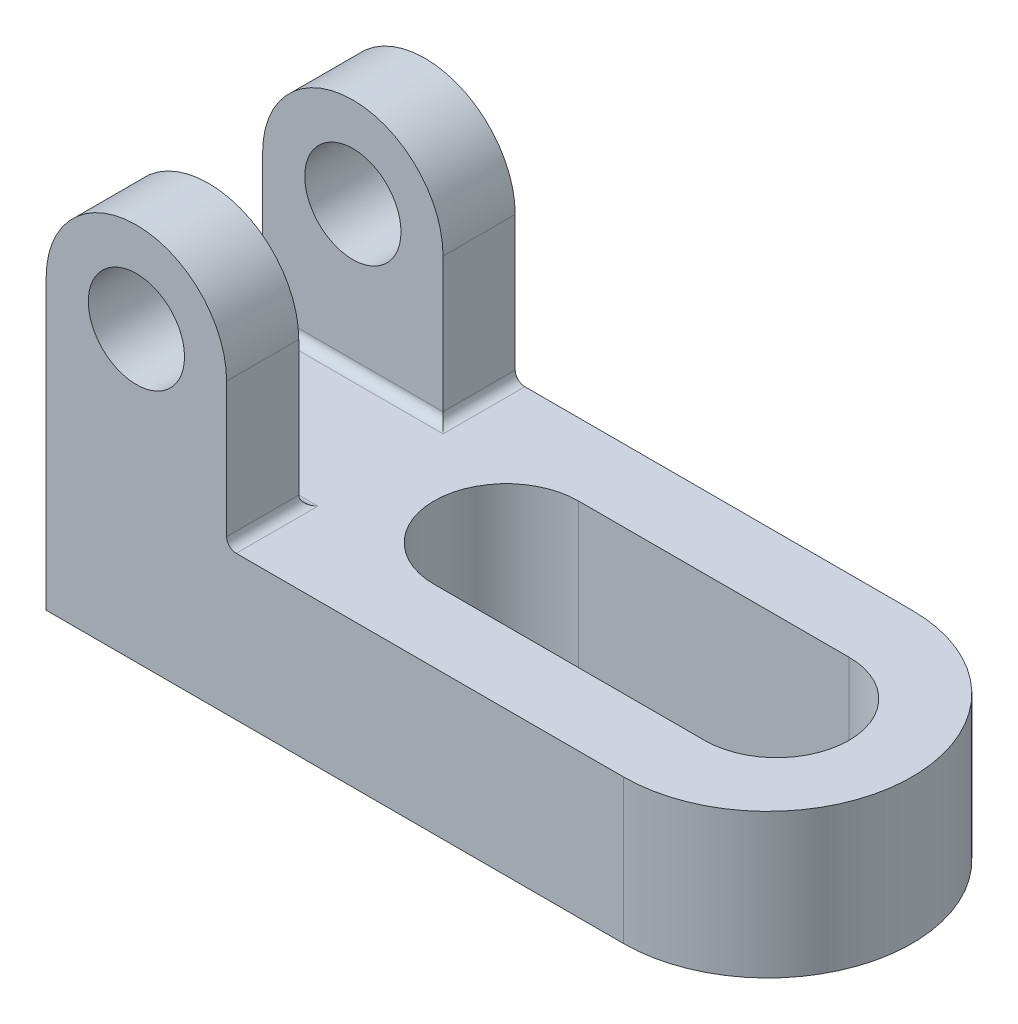
ISO-10303-21;
HEADER;
FILE_DESCRIPTION(('STEP AP214'),'2;1');
FILE_NAME('part.step','',(''),(''),'','','');
FILE_SCHEMA(('AUTOMOTIVE_DESIGN { 1 0 10303 214 1 1 1 1 }'));
ENDSEC;
DATA;
#1=APPLICATION_CONTEXT('core data for automotive mechanical design processes');
#2=APPLICATION_PROTOCOL_DEFINITION('international standard','automotive_design',2000,#1);
#3=PRODUCT_CONTEXT('',#1,'mechanical');
#4=PRODUCT('Part','Part','',(#3));
#5=PRODUCT_RELATED_PRODUCT_CATEGORY('part','',(#4));
#6=PRODUCT_DEFINITION_FORMATION('','',#4);
#7=PRODUCT_DEFINITION_CONTEXT('part definition',#1,'design');
#8=PRODUCT_DEFINITION('design','',#6,#7);
#9=PRODUCT_DEFINITION_SHAPE('','',#8);
#10=(LENGTH_UNIT() NAMED_UNIT(*) SI_UNIT(.MILLI.,.METRE.));
#11=(NAMED_UNIT(*) PLANE_ANGLE_UNIT() SI_UNIT($,.RADIAN.));
#12=(NAMED_UNIT(*) SI_UNIT($,.STERADIAN.) SOLID_ANGLE_UNIT());
#13=UNCERTAINTY_MEASURE_WITH_UNIT(LENGTH_MEASURE(1.E-05),#10,'distance_accuracy_value','');
#14=(GEOMETRIC_REPRESENTATION_CONTEXT(3) GLOBAL_UNCERTAINTY_ASSIGNED_CONTEXT((#13)) GLOBAL_UNIT_ASSIGNED_CONTEXT((#10,
#11,#12)) REPRESENTATION_CONTEXT('',''));
#15=CARTESIAN_POINT('',(0.,0.,0.));
#16=DIRECTION('',(0.,0.,1.));
#17=DIRECTION('',(1.,0.,0.));
#18=AXIS2_PLACEMENT_3D('',#15,#16,#17);
#19=CARTESIAN_POINT('',(45.,-30.,-30.));
#20=DIRECTION('',(0.,1.,0.));
#21=DIRECTION('',(0.,0.,1.));
#22=AXIS2_PLACEMENT_3D('',#19,#20,#21);
#23=CYLINDRICAL_SURFACE('',#22,30.);
#24=DIRECTION('',(0.,-1.,0.));
#25=VECTOR('',#24,1.);
#26=CARTESIAN_POINT('',(45.,-30.,0.));
#27=LINE('',#26,#25);
#28=CARTESIAN_POINT('',(45.,-30.,0.));
#29=VERTEX_POINT('',#28);
#30=CARTESIAN_POINT('',(45.,0.,0.));
#31=VERTEX_POINT('',#30);
#32=EDGE_CURVE('E261',#29,#31,#27,.F.);
#33=ORIENTED_EDGE('',*,*,#32,.F.);
#34=CARTESIAN_POINT('',(45.,-30.,-30.));
#35=DIRECTION('',(0.,-1.,0.));
#36=DIRECTION('',(1.,0.,0.));
#37=AXIS2_PLACEMENT_3D('',#34,#35,#36);
#38=CIRCLE('',#37,30.);
#39=CARTESIAN_POINT('',(45.,-30.,-60.));
#40=VERTEX_POINT('',#39);
#41=EDGE_CURVE('E277',#40,#29,#38,.T.);
#42=ORIENTED_EDGE('',*,*,#41,.F.);
#43=DIRECTION('',(0.,1.,0.));
#44=VECTOR('',#43,1.);
#45=CARTESIAN_POINT('',(45.,30.,-60.));
#46=LINE('',#45,#44);
#47=CARTESIAN_POINT('',(45.,0.,-60.));
#48=VERTEX_POINT('',#47);
#49=EDGE_CURVE('E274',#48,#40,#46,.F.);
#50=ORIENTED_EDGE('',*,*,#49,.F.);
#51=CARTESIAN_POINT('',(45.,0.,-30.));
#52=DIRECTION('',(0.,1.,0.));
#53=DIRECTION('',(-1.,0.,0.));
#54=AXIS2_PLACEMENT_3D('',#51,#52,#53);
#55=CIRCLE('',#54,30.);
#56=EDGE_CURVE('E279',#31,#48,#55,.T.);
#57=ORIENTED_EDGE('',*,*,#56,.F.);
#58=EDGE_LOOP('',(#33,#42,#50,#57));
#59=FACE_BOUND('',#58,.T.);
#60=ADVANCED_FACE('F39',(#59),#23,.T.);
#61=CARTESIAN_POINT('',(-56.25,30.,-60.));
#62=DIRECTION('',(0.,0.,1.));
#63=DIRECTION('',(1.,0.,0.));
#64=AXIS2_PLACEMENT_3D('',#61,#62,#63);
#65=CYLINDRICAL_SURFACE('',#64,18.75);
#66=CARTESIAN_POINT('',(-56.25,30.,-15.));
#67=DIRECTION('',(0.,0.,1.));
#68=DIRECTION('',(1.,0.,0.));
#69=AXIS2_PLACEMENT_3D('',#66,#67,#68);
#70=CIRCLE('',#69,18.75);
#71=CARTESIAN_POINT('',(-75.,30.,-15.));
#72=VERTEX_POINT('',#71);
#73=CARTESIAN_POINT('',(-37.5,30.,-15.));
#74=VERTEX_POINT('',#73);
#75=EDGE_CURVE('E219',#72,#74,#70,.F.);
#76=ORIENTED_EDGE('',*,*,#75,.F.);
#77=DIRECTION('',(0.,0.,1.));
#78=VECTOR('',#77,1.);
#79=CARTESIAN_POINT('',(-75.,30.,-60.));
#80=LINE('',#79,#78);
#81=CARTESIAN_POINT('',(-75.,30.,0.));
#82=VERTEX_POINT('',#81);
#83=EDGE_CURVE('E262',#72,#82,#80,.T.);
#84=ORIENTED_EDGE('',*,*,#83,.T.);
#85=CARTESIAN_POINT('',(-56.25,30.,0.));
#86=DIRECTION('',(0.,0.,1.));
#87=DIRECTION('',(-1.,0.,0.));
#88=AXIS2_PLACEMENT_3D('',#85,#86,#87);
#89=CIRCLE('',#88,18.75);
#90=CARTESIAN_POINT('',(-37.5,30.,0.));
#91=VERTEX_POINT('',#90);
#92=EDGE_CURVE('E235',#91,#82,#89,.T.);
#93=ORIENTED_EDGE('',*,*,#92,.F.);
#94=DIRECTION('',(0.,0.,1.));
#95=VECTOR('',#94,1.);
#96=CARTESIAN_POINT('',(-37.5,30.,-60.));
#97=LINE('',#96,#95);
#98=EDGE_CURVE('E266',#74,#91,#97,.T.);
#99=ORIENTED_EDGE('',*,*,#98,.F.);
#100=EDGE_LOOP('',(#76,#84,#93,#99));
#101=FACE_BOUND('',#100,.T.);
#102=ADVANCED_FACE('F348',(#101),#65,.T.);
#103=CARTESIAN_POINT('',(-37.5,0.,-60.));
#104=DIRECTION('',(1.,0.,0.));
#105=DIRECTION('',(0.,0.,-1.));
#106=AXIS2_PLACEMENT_3D('',#103,#104,#105);
#107=PLANE('',#106);
#108=DIRECTION('',(0.,-1.,0.));
#109=VECTOR('',#108,1.);
#110=CARTESIAN_POINT('',(-37.5,48.75,-45.));
#111=LINE('',#110,#109);
#112=CARTESIAN_POINT('',(-37.5,30.,-45.));
#113=VERTEX_POINT('',#112);
#114=CARTESIAN_POINT('',(-37.5,1.99999999999999,-45.));
#115=VERTEX_POINT('',#114);
#116=EDGE_CURVE('E207',#113,#115,#111,.T.);
#117=ORIENTED_EDGE('',*,*,#116,.T.);
#118=DIRECTION('',(0.,0.,1.));
#119=VECTOR('',#118,1.);
#120=CARTESIAN_POINT('',(-37.5,2.,-60.));
#121=LINE('',#120,#119);
#122=CARTESIAN_POINT('',(-37.5,2.,-60.));
#123=VERTEX_POINT('',#122);
#124=EDGE_CURVE('E62',#115,#123,#121,.F.);
#125=ORIENTED_EDGE('',*,*,#124,.T.);
#126=DIRECTION('',(0.,1.,0.));
#127=VECTOR('',#126,1.);
#128=CARTESIAN_POINT('',(-37.5,0.,-60.));
#129=LINE('',#128,#127);
#130=CARTESIAN_POINT('',(-37.5,30.,-60.));
#131=VERTEX_POINT('',#130);
#132=EDGE_CURVE('E241',#123,#131,#129,.T.);
#133=ORIENTED_EDGE('',*,*,#132,.T.);
#134=EDGE_CURVE('E263',#131,#113,#97,.T.);
#135=ORIENTED_EDGE('',*,*,#134,.T.);
#136=EDGE_LOOP('',(#117,#125,#133,#135));
#137=FACE_BOUND('',#136,.T.);
#138=ADVANCED_FACE('F321',(#137),#107,.T.);
#139=CARTESIAN_POINT('',(-56.25,30.,-60.));
#140=DIRECTION('',(0.,0.,1.));
#141=DIRECTION('',(1.,0.,0.));
#142=AXIS2_PLACEMENT_3D('',#139,#140,#141);
#143=CYLINDRICAL_SURFACE('',#142,10.);
#144=CARTESIAN_POINT('',(-56.25,30.,-45.));
#145=DIRECTION('',(0.,0.,-1.));
#146=DIRECTION('',(-1.,0.,0.));
#147=AXIS2_PLACEMENT_3D('',#144,#145,#146);
#148=CIRCLE('',#147,10.);
#149=CARTESIAN_POINT('',(-66.25,30.,-45.));
#150=VERTEX_POINT('',#149);
#151=EDGE_CURVE('E221',#150,#150,#148,.F.);
#152=ORIENTED_EDGE('',*,*,#151,.T.);
#153=EDGE_LOOP('',(#152));
#154=FACE_BOUND('',#153,.T.);
#155=CARTESIAN_POINT('',(-56.25,30.,-60.));
#156=DIRECTION('',(0.,0.,1.));
#157=DIRECTION('',(1.,0.,0.));
#158=AXIS2_PLACEMENT_3D('',#155,#156,#157);
#159=CIRCLE('',#158,10.);
#160=CARTESIAN_POINT('',(-46.25,30.,-60.));
#161=VERTEX_POINT('',#160);
#162=EDGE_CURVE('E225',#161,#161,#159,.T.);
#163=ORIENTED_EDGE('',*,*,#162,.F.);
#164=EDGE_LOOP('',(#163));
#165=FACE_BOUND('',#164,.T.);
#166=ADVANCED_FACE('F449',(#154,#165),#143,.F.);
#167=CARTESIAN_POINT('',(-75.,30.,-60.));
#168=DIRECTION('',(-1.,0.,0.));
#169=DIRECTION('',(0.,0.,1.));
#170=AXIS2_PLACEMENT_3D('',#167,#168,#169);
#171=PLANE('',#170);
#172=DIRECTION('',(0.,-1.,0.));
#173=VECTOR('',#172,1.);
#174=CARTESIAN_POINT('',(-75.,48.75,-45.));
#175=LINE('',#174,#173);
#176=CARTESIAN_POINT('',(-75.,30.,-45.));
#177=VERTEX_POINT('',#176);
#178=CARTESIAN_POINT('',(-75.,1.99999999999999,-45.));
#179=VERTEX_POINT('',#178);
#180=EDGE_CURVE('E208',#177,#179,#175,.T.);
#181=ORIENTED_EDGE('',*,*,#180,.F.);
#182=CARTESIAN_POINT('',(-75.,30.,-60.));
#183=VERTEX_POINT('',#182);
#184=EDGE_CURVE('E258',#183,#177,#80,.T.);
#185=ORIENTED_EDGE('',*,*,#184,.F.);
#186=DIRECTION('',(0.,-1.,0.));
#187=VECTOR('',#186,1.);
#188=CARTESIAN_POINT('',(-75.,30.,-60.));
#189=LINE('',#188,#187);
#190=CARTESIAN_POINT('',(-75.,-30.,-60.));
#191=VERTEX_POINT('',#190);
#192=EDGE_CURVE('E231',#183,#191,#189,.T.);
#193=ORIENTED_EDGE('',*,*,#192,.T.);
#194=DIRECTION('',(0.,0.,1.));
#195=VECTOR('',#194,1.);
#196=CARTESIAN_POINT('',(-75.,-30.,-60.));
#197=LINE('',#196,#195);
#198=CARTESIAN_POINT('',(-75.,-30.,0.));
#199=VERTEX_POINT('',#198);
#200=EDGE_CURVE('E246',#191,#199,#197,.T.);
#201=ORIENTED_EDGE('',*,*,#200,.T.);
#202=DIRECTION('',(0.,-1.,0.));
#203=VECTOR('',#202,1.);
#204=CARTESIAN_POINT('',(-75.,30.,0.));
#205=LINE('',#204,#203);
#206=EDGE_CURVE('E228',#82,#199,#205,.T.);
#207=ORIENTED_EDGE('',*,*,#206,.F.);
#208=ORIENTED_EDGE('',*,*,#83,.F.);
#209=DIRECTION('',(0.,-1.,0.));
#210=VECTOR('',#209,1.);
#211=CARTESIAN_POINT('',(-75.,48.75,-15.));
#212=LINE('',#211,#210);
#213=CARTESIAN_POINT('',(-75.,1.99999999999999,-15.));
#214=VERTEX_POINT('',#213);
#215=EDGE_CURVE('E212',#72,#214,#212,.T.);
#216=ORIENTED_EDGE('',*,*,#215,.T.);
#217=CARTESIAN_POINT('',(-75.,1.99999999999999,-17.));
#218=DIRECTION('',(-1.,0.,0.));
#219=DIRECTION('',(0.,0.,1.));
#220=AXIS2_PLACEMENT_3D('',#217,#218,#219);
#221=CIRCLE('',#220,2.);
#222=CARTESIAN_POINT('',(-75.,0.,-17.));
#223=VERTEX_POINT('',#222);
#224=EDGE_CURVE('E298',#214,#223,#221,.F.);
#225=ORIENTED_EDGE('',*,*,#224,.T.);
#226=DIRECTION('',(0.,0.,1.));
#227=VECTOR('',#226,1.);
#228=CARTESIAN_POINT('',(-75.,0.,-45.));
#229=LINE('',#228,#227);
#230=CARTESIAN_POINT('',(-75.,0.,-43.));
#231=VERTEX_POINT('',#230);
#232=EDGE_CURVE('E201',#231,#223,#229,.T.);
#233=ORIENTED_EDGE('',*,*,#232,.F.);
#234=CARTESIAN_POINT('',(-75.,1.99999999999999,-43.));
#235=DIRECTION('',(-1.,0.,0.));
#236=DIRECTION('',(0.,0.,1.));
#237=AXIS2_PLACEMENT_3D('',#234,#235,#236);
#238=CIRCLE('',#237,2.);
#239=EDGE_CURVE('E300',#231,#179,#238,.F.);
#240=ORIENTED_EDGE('',*,*,#239,.T.);
#241=EDGE_LOOP('',(#181,#185,#193,#201,#207,#208,#216,#225,#233,#240));
#242=FACE_BOUND('',#241,.T.);
#243=ADVANCED_FACE('F332',(#242),#171,.T.);
#244=CARTESIAN_POINT('',(-56.25,30.,-45.));
#245=DIRECTION('',(0.,0.,-1.));
#246=DIRECTION('',(-1.,0.,0.));
#247=AXIS2_PLACEMENT_3D('',#244,#245,#246);
#248=CIRCLE('',#247,18.75);
#249=EDGE_CURVE('E222',#113,#177,#248,.F.);
#250=ORIENTED_EDGE('',*,*,#249,.F.);
#251=ORIENTED_EDGE('',*,*,#134,.F.);
#252=CARTESIAN_POINT('',(-56.25,30.,-60.));
#253=DIRECTION('',(0.,0.,1.));
#254=DIRECTION('',(-1.,0.,0.));
#255=AXIS2_PLACEMENT_3D('',#252,#253,#254);
#256=CIRCLE('',#255,18.75);
#257=EDGE_CURVE('E243',#131,#183,#256,.T.);
#258=ORIENTED_EDGE('',*,*,#257,.T.);
#259=ORIENTED_EDGE('',*,*,#184,.T.);
#260=EDGE_LOOP('',(#250,#251,#258,#259));
#261=FACE_BOUND('',#260,.T.);
#262=ADVANCED_FACE('F325',(#261),#65,.T.);
#263=DIRECTION('',(0.,1.,0.));
#264=VECTOR('',#263,1.);
#265=CARTESIAN_POINT('',(-37.5,0.,0.));
#266=LINE('',#265,#264);
#267=CARTESIAN_POINT('',(-37.5,2.,0.));
#268=VERTEX_POINT('',#267);
#269=EDGE_CURVE('E254',#268,#91,#266,.T.);
#270=ORIENTED_EDGE('',*,*,#269,.F.);
#271=DIRECTION('',(0.,0.,1.));
#272=VECTOR('',#271,1.);
#273=CARTESIAN_POINT('',(-37.5,2.,-15.));
#274=LINE('',#273,#272);
#275=CARTESIAN_POINT('',(-37.5,1.99999999999999,-15.));
#276=VERTEX_POINT('',#275);
#277=EDGE_CURVE('E296',#268,#276,#274,.F.);
#278=ORIENTED_EDGE('',*,*,#277,.T.);
#279=DIRECTION('',(0.,-1.,0.));
#280=VECTOR('',#279,1.);
#281=CARTESIAN_POINT('',(-37.5,48.75,-15.));
#282=LINE('',#281,#280);
#283=EDGE_CURVE('E215',#74,#276,#282,.T.);
#284=ORIENTED_EDGE('',*,*,#283,.F.);
#285=ORIENTED_EDGE('',*,*,#98,.T.);
#286=EDGE_LOOP('',(#270,#278,#284,#285));
#287=FACE_BOUND('',#286,.T.);
#288=ADVANCED_FACE('F352',(#287),#107,.T.);
#289=CARTESIAN_POINT('',(-37.5,0.,-60.));
#290=DIRECTION('',(0.,1.,0.));
#291=DIRECTION('',(-1.,0.,0.));
#292=AXIS2_PLACEMENT_3D('',#289,#290,#291);
#293=PLANE('',#292);
#294=DIRECTION('',(-1.,0.,0.));
#295=VECTOR('',#294,1.);
#296=CARTESIAN_POINT('',(0.,0.,-45.));
#297=LINE('',#296,#295);
#298=CARTESIAN_POINT('',(46.875,0.,-45.));
#299=VERTEX_POINT('',#298);
#300=CARTESIAN_POINT('',(-9.37499999999999,0.,-45.));
#301=VERTEX_POINT('',#300);
#302=EDGE_CURVE('E167',#299,#301,#297,.T.);
#303=ORIENTED_EDGE('',*,*,#302,.F.);
#304=CARTESIAN_POINT('',(46.875,0.,-30.));
#305=DIRECTION('',(0.,1.,0.));
#306=DIRECTION('',(0.,0.,1.));
#307=AXIS2_PLACEMENT_3D('',#304,#305,#306);
#308=CIRCLE('',#307,15.);
#309=CARTESIAN_POINT('',(46.875,0.,-15.));
#310=VERTEX_POINT('',#309);
#311=EDGE_CURVE('E185',#310,#299,#308,.T.);
#312=ORIENTED_EDGE('',*,*,#311,.F.);
#313=DIRECTION('',(-1.,0.,0.));
#314=VECTOR('',#313,1.);
#315=CARTESIAN_POINT('',(0.,0.,-15.));
#316=LINE('',#315,#314);
#317=CARTESIAN_POINT('',(-9.37499999999999,0.,-15.));
#318=VERTEX_POINT('',#317);
#319=EDGE_CURVE('E188',#310,#318,#316,.T.);
#320=ORIENTED_EDGE('',*,*,#319,.T.);
#321=CARTESIAN_POINT('',(-9.37499999999999,0.,-30.));
#322=DIRECTION('',(0.,1.,0.));
#323=DIRECTION('',(0.,0.,1.));
#324=AXIS2_PLACEMENT_3D('',#321,#322,#323);
#325=CIRCLE('',#324,15.);
#326=EDGE_CURVE('E194',#301,#318,#325,.T.);
#327=ORIENTED_EDGE('',*,*,#326,.F.);
#328=EDGE_LOOP('',(#303,#312,#320,#327));
#329=FACE_BOUND('',#328,.T.);
#330=DIRECTION('',(0.,0.,1.));
#331=VECTOR('',#330,1.);
#332=CARTESIAN_POINT('',(-35.5,0.,-45.));
#333=LINE('',#332,#331);
#334=CARTESIAN_POINT('',(-35.5,0.,-60.));
#335=VERTEX_POINT('',#334);
#336=CARTESIAN_POINT('',(-35.5,0.,-43.));
#337=VERTEX_POINT('',#336);
#338=EDGE_CURVE('E288',#335,#337,#333,.T.);
#339=ORIENTED_EDGE('',*,*,#338,.T.);
#340=DIRECTION('',(1.,0.,0.));
#341=VECTOR('',#340,1.);
#342=CARTESIAN_POINT('',(-37.5,0.,-43.));
#343=LINE('',#342,#341);
#344=EDGE_CURVE('E290',#337,#231,#343,.F.);
#345=ORIENTED_EDGE('',*,*,#344,.T.);
#346=ORIENTED_EDGE('',*,*,#232,.T.);
#347=DIRECTION('',(-1.,0.,0.));
#348=VECTOR('',#347,1.);
#349=CARTESIAN_POINT('',(-37.5,0.,-17.));
#350=LINE('',#349,#348);
#351=CARTESIAN_POINT('',(-35.5,0.,-17.));
#352=VERTEX_POINT('',#351);
#353=EDGE_CURVE('E286',#223,#352,#350,.F.);
#354=ORIENTED_EDGE('',*,*,#353,.T.);
#355=DIRECTION('',(0.,0.,1.));
#356=VECTOR('',#355,1.);
#357=CARTESIAN_POINT('',(-35.5,0.,0.));
#358=LINE('',#357,#356);
#359=CARTESIAN_POINT('',(-35.5,0.,0.));
#360=VERTEX_POINT('',#359);
#361=EDGE_CURVE('E284',#352,#360,#358,.T.);
#362=ORIENTED_EDGE('',*,*,#361,.T.);
#363=DIRECTION('',(-1.,0.,0.));
#364=VECTOR('',#363,1.);
#365=CARTESIAN_POINT('',(-37.5,0.,0.));
#366=LINE('',#365,#364);
#367=EDGE_CURVE('E252',#31,#360,#366,.T.);
#368=ORIENTED_EDGE('',*,*,#367,.F.);
#369=ORIENTED_EDGE('',*,*,#56,.T.);
#370=DIRECTION('',(-1.,0.,0.));
#371=VECTOR('',#370,1.);
#372=CARTESIAN_POINT('',(-37.5,0.,-60.));
#373=LINE('',#372,#371);
#374=EDGE_CURVE('E238',#48,#335,#373,.T.);
#375=ORIENTED_EDGE('',*,*,#374,.T.);
#376=EDGE_LOOP('',(#339,#345,#346,#354,#362,#368,#369,#375));
#377=FACE_BOUND('',#376,.T.);
#378=ADVANCED_FACE('F337',(#329,#377),#293,.T.);
#379=CARTESIAN_POINT('',(75.,-30.,-60.));
#380=DIRECTION('',(0.,-1.,0.));
#381=DIRECTION('',(1.,0.,0.));
#382=AXIS2_PLACEMENT_3D('',#379,#380,#381);
#383=PLANE('',#382);
#384=DIRECTION('',(-1.,0.,0.));
#385=VECTOR('',#384,1.);
#386=CARTESIAN_POINT('',(0.,-30.,-45.));
#387=LINE('',#386,#385);
#388=CARTESIAN_POINT('',(46.875,-30.,-45.));
#389=VERTEX_POINT('',#388);
#390=CARTESIAN_POINT('',(-9.37499999999999,-30.,-45.));
#391=VERTEX_POINT('',#390);
#392=EDGE_CURVE('E164',#389,#391,#387,.T.);
#393=ORIENTED_EDGE('',*,*,#392,.T.);
#394=CARTESIAN_POINT('',(-9.37499999999999,-30.,-30.));
#395=DIRECTION('',(0.,1.,0.));
#396=DIRECTION('',(0.,0.,1.));
#397=AXIS2_PLACEMENT_3D('',#394,#395,#396);
#398=CIRCLE('',#397,15.);
#399=CARTESIAN_POINT('',(-9.37499999999999,-30.,-15.));
#400=VERTEX_POINT('',#399);
#401=EDGE_CURVE('E175',#391,#400,#398,.T.);
#402=ORIENTED_EDGE('',*,*,#401,.T.);
#403=DIRECTION('',(-1.,0.,0.));
#404=VECTOR('',#403,1.);
#405=CARTESIAN_POINT('',(0.,-30.,-15.));
#406=LINE('',#405,#404);
#407=CARTESIAN_POINT('',(46.875,-30.,-15.));
#408=VERTEX_POINT('',#407);
#409=EDGE_CURVE('E180',#408,#400,#406,.T.);
#410=ORIENTED_EDGE('',*,*,#409,.F.);
#411=CARTESIAN_POINT('',(46.875,-30.,-30.));
#412=DIRECTION('',(0.,1.,0.));
#413=DIRECTION('',(0.,0.,1.));
#414=AXIS2_PLACEMENT_3D('',#411,#412,#413);
#415=CIRCLE('',#414,15.);
#416=EDGE_CURVE('E172',#408,#389,#415,.T.);
#417=ORIENTED_EDGE('',*,*,#416,.T.);
#418=EDGE_LOOP('',(#393,#402,#410,#417));
#419=FACE_BOUND('',#418,.T.);
#420=DIRECTION('',(1.,0.,0.));
#421=VECTOR('',#420,1.);
#422=CARTESIAN_POINT('',(75.,-30.,-60.));
#423=LINE('',#422,#421);
#424=EDGE_CURVE('E234',#191,#40,#423,.T.);
#425=ORIENTED_EDGE('',*,*,#424,.T.);
#426=ORIENTED_EDGE('',*,*,#41,.T.);
#427=DIRECTION('',(1.,0.,0.));
#428=VECTOR('',#427,1.);
#429=CARTESIAN_POINT('',(75.,-30.,0.));
#430=LINE('',#429,#428);
#431=EDGE_CURVE('E249',#199,#29,#430,.T.);
#432=ORIENTED_EDGE('',*,*,#431,.F.);
#433=ORIENTED_EDGE('',*,*,#200,.F.);
#434=EDGE_LOOP('',(#425,#426,#432,#433));
#435=FACE_BOUND('',#434,.T.);
#436=ADVANCED_FACE('F182',(#419,#435),#383,.T.);
#437=CARTESIAN_POINT('',(-56.25,30.,-60.));
#438=DIRECTION('',(0.,0.,-1.));
#439=DIRECTION('',(-1.,0.,0.));
#440=AXIS2_PLACEMENT_3D('',#437,#438,#439);
#441=PLANE('',#440);
#442=ORIENTED_EDGE('',*,*,#162,.T.);
#443=EDGE_LOOP('',(#442));
#444=FACE_BOUND('',#443,.T.);
#445=ORIENTED_EDGE('',*,*,#374,.F.);
#446=ORIENTED_EDGE('',*,*,#49,.T.);
#447=ORIENTED_EDGE('',*,*,#424,.F.);
#448=ORIENTED_EDGE('',*,*,#192,.F.);
#449=ORIENTED_EDGE('',*,*,#257,.F.);
#450=ORIENTED_EDGE('',*,*,#132,.F.);
#451=CARTESIAN_POINT('',(-35.5,2.,-60.));
#452=DIRECTION('',(0.,0.,-1.));
#453=DIRECTION('',(-1.,0.,0.));
#454=AXIS2_PLACEMENT_3D('',#451,#452,#453);
#455=CIRCLE('',#454,2.);
#456=EDGE_CURVE('E48',#123,#335,#455,.F.);
#457=ORIENTED_EDGE('',*,*,#456,.T.);
#458=EDGE_LOOP('',(#445,#446,#447,#448,#449,#450,#457));
#459=FACE_BOUND('',#458,.T.);
#460=ADVANCED_FACE('F329',(#444,#459),#441,.T.);
#461=CARTESIAN_POINT('',(-56.25,30.,0.));
#462=DIRECTION('',(0.,0.,-1.));
#463=DIRECTION('',(-1.,0.,0.));
#464=AXIS2_PLACEMENT_3D('',#461,#462,#463);
#465=PLANE('',#464);
#466=CARTESIAN_POINT('',(-56.25,30.,0.));
#467=DIRECTION('',(0.,0.,1.));
#468=DIRECTION('',(1.,0.,0.));
#469=AXIS2_PLACEMENT_3D('',#466,#467,#468);
#470=CIRCLE('',#469,10.);
#471=CARTESIAN_POINT('',(-46.25,30.,0.));
#472=VERTEX_POINT('',#471);
#473=EDGE_CURVE('E224',#472,#472,#470,.T.);
#474=ORIENTED_EDGE('',*,*,#473,.F.);
#475=EDGE_LOOP('',(#474));
#476=FACE_BOUND('',#475,.T.);
#477=ORIENTED_EDGE('',*,*,#431,.T.);
#478=ORIENTED_EDGE('',*,*,#32,.T.);
#479=ORIENTED_EDGE('',*,*,#367,.T.);
#480=CARTESIAN_POINT('',(-35.5,2.,0.));
#481=DIRECTION('',(0.,0.,-1.));
#482=DIRECTION('',(-1.,0.,0.));
#483=AXIS2_PLACEMENT_3D('',#480,#481,#482);
#484=CIRCLE('',#483,2.);
#485=EDGE_CURVE('E11',#360,#268,#484,.T.);
#486=ORIENTED_EDGE('',*,*,#485,.T.);
#487=ORIENTED_EDGE('',*,*,#269,.T.);
#488=ORIENTED_EDGE('',*,*,#92,.T.);
#489=ORIENTED_EDGE('',*,*,#206,.T.);
#490=EDGE_LOOP('',(#477,#478,#479,#486,#487,#488,#489));
#491=FACE_BOUND('',#490,.T.);
#492=ADVANCED_FACE('F357',(#476,#491),#465,.F.);
#493=CARTESIAN_POINT('',(-56.25,30.,-15.));
#494=DIRECTION('',(0.,0.,1.));
#495=DIRECTION('',(1.,0.,0.));
#496=AXIS2_PLACEMENT_3D('',#493,#494,#495);
#497=CIRCLE('',#496,10.);
#498=CARTESIAN_POINT('',(-46.25,30.,-15.));
#499=VERTEX_POINT('',#498);
#500=EDGE_CURVE('E211',#499,#499,#497,.F.);
#501=ORIENTED_EDGE('',*,*,#500,.T.);
#502=EDGE_LOOP('',(#501));
#503=FACE_BOUND('',#502,.T.);
#504=ORIENTED_EDGE('',*,*,#473,.T.);
#505=EDGE_LOOP('',(#504));
#506=FACE_BOUND('',#505,.T.);
#507=ADVANCED_FACE('F440',(#503,#506),#143,.F.);
#508=CARTESIAN_POINT('',(-75.,48.75,-45.));
#509=DIRECTION('',(0.,0.,-1.));
#510=DIRECTION('',(-1.,0.,0.));
#511=AXIS2_PLACEMENT_3D('',#508,#509,#510);
#512=PLANE('',#511);
#513=ORIENTED_EDGE('',*,*,#180,.T.);
#514=DIRECTION('',(1.,0.,0.));
#515=VECTOR('',#514,1.);
#516=CARTESIAN_POINT('',(-75.,1.99999999999999,-45.));
#517=LINE('',#516,#515);
#518=EDGE_CURVE('E292',#179,#115,#517,.T.);
#519=ORIENTED_EDGE('',*,*,#518,.T.);
#520=ORIENTED_EDGE('',*,*,#116,.F.);
#521=ORIENTED_EDGE('',*,*,#249,.T.);
#522=EDGE_LOOP('',(#513,#519,#520,#521));
#523=FACE_BOUND('',#522,.T.);
#524=ORIENTED_EDGE('',*,*,#151,.F.);
#525=EDGE_LOOP('',(#524));
#526=FACE_BOUND('',#525,.T.);
#527=ADVANCED_FACE('F317',(#523,#526),#512,.F.);
#528=CARTESIAN_POINT('',(-37.5,48.75,-15.));
#529=DIRECTION('',(0.,0.,1.));
#530=DIRECTION('',(1.,0.,0.));
#531=AXIS2_PLACEMENT_3D('',#528,#529,#530);
#532=PLANE('',#531);
#533=ORIENTED_EDGE('',*,*,#283,.T.);
#534=DIRECTION('',(-1.,0.,0.));
#535=VECTOR('',#534,1.);
#536=CARTESIAN_POINT('',(-37.5,1.99999999999999,-15.));
#537=LINE('',#536,#535);
#538=EDGE_CURVE('E281',#276,#214,#537,.T.);
#539=ORIENTED_EDGE('',*,*,#538,.T.);
#540=ORIENTED_EDGE('',*,*,#215,.F.);
#541=ORIENTED_EDGE('',*,*,#75,.T.);
#542=EDGE_LOOP('',(#533,#539,#540,#541));
#543=FACE_BOUND('',#542,.T.);
#544=ORIENTED_EDGE('',*,*,#500,.F.);
#545=EDGE_LOOP('',(#544));
#546=FACE_BOUND('',#545,.T.);
#547=ADVANCED_FACE('F341',(#543,#546),#532,.F.);
#548=CARTESIAN_POINT('',(0.,-30.,-45.));
#549=DIRECTION('',(0.,0.,-1.));
#550=DIRECTION('',(-1.,0.,0.));
#551=AXIS2_PLACEMENT_3D('',#548,#549,#550);
#552=PLANE('',#551);
#553=ORIENTED_EDGE('',*,*,#302,.T.);
#554=DIRECTION('',(0.,1.,0.));
#555=VECTOR('',#554,1.);
#556=CARTESIAN_POINT('',(-9.37499999999999,-30.,-45.));
#557=LINE('',#556,#555);
#558=EDGE_CURVE('E160',#391,#301,#557,.T.);
#559=ORIENTED_EDGE('',*,*,#558,.F.);
#560=ORIENTED_EDGE('',*,*,#392,.F.);
#561=DIRECTION('',(0.,1.,0.));
#562=VECTOR('',#561,1.);
#563=CARTESIAN_POINT('',(46.875,-30.,-45.));
#564=LINE('',#563,#562);
#565=EDGE_CURVE('E199',#389,#299,#564,.T.);
#566=ORIENTED_EDGE('',*,*,#565,.T.);
#567=EDGE_LOOP('',(#553,#559,#560,#566));
#568=FACE_BOUND('',#567,.T.);
#569=ADVANCED_FACE('F162',(#568),#552,.F.);
#570=CARTESIAN_POINT('',(46.875,-30.,-30.));
#571=DIRECTION('',(0.,1.,0.));
#572=DIRECTION('',(0.,0.,1.));
#573=AXIS2_PLACEMENT_3D('',#570,#571,#572);
#574=CYLINDRICAL_SURFACE('',#573,15.);
#575=ORIENTED_EDGE('',*,*,#311,.T.);
#576=ORIENTED_EDGE('',*,*,#565,.F.);
#577=ORIENTED_EDGE('',*,*,#416,.F.);
#578=DIRECTION('',(0.,1.,0.));
#579=VECTOR('',#578,1.);
#580=CARTESIAN_POINT('',(46.875,-30.,-15.));
#581=LINE('',#580,#579);
#582=EDGE_CURVE('E202',#408,#310,#581,.T.);
#583=ORIENTED_EDGE('',*,*,#582,.T.);
#584=EDGE_LOOP('',(#575,#576,#577,#583));
#585=FACE_BOUND('',#584,.T.);
#586=ADVANCED_FACE('F413',(#585),#574,.F.);
#587=CARTESIAN_POINT('',(0.,-30.,-15.));
#588=DIRECTION('',(0.,0.,-1.));
#589=DIRECTION('',(-1.,0.,0.));
#590=AXIS2_PLACEMENT_3D('',#587,#588,#589);
#591=PLANE('',#590);
#592=ORIENTED_EDGE('',*,*,#319,.F.);
#593=ORIENTED_EDGE('',*,*,#582,.F.);
#594=ORIENTED_EDGE('',*,*,#409,.T.);
#595=DIRECTION('',(0.,1.,0.));
#596=VECTOR('',#595,1.);
#597=CARTESIAN_POINT('',(-9.37499999999999,-30.,-15.));
#598=LINE('',#597,#596);
#599=EDGE_CURVE('E171',#400,#318,#598,.T.);
#600=ORIENTED_EDGE('',*,*,#599,.T.);
#601=EDGE_LOOP('',(#592,#593,#594,#600));
#602=FACE_BOUND('',#601,.T.);
#603=ADVANCED_FACE('F406',(#602),#591,.T.);
#604=CARTESIAN_POINT('',(-9.37499999999999,-30.,-30.));
#605=DIRECTION('',(0.,1.,0.));
#606=DIRECTION('',(0.,0.,1.));
#607=AXIS2_PLACEMENT_3D('',#604,#605,#606);
#608=CYLINDRICAL_SURFACE('',#607,15.);
#609=ORIENTED_EDGE('',*,*,#326,.T.);
#610=ORIENTED_EDGE('',*,*,#599,.F.);
#611=ORIENTED_EDGE('',*,*,#401,.F.);
#612=ORIENTED_EDGE('',*,*,#558,.T.);
#613=EDGE_LOOP('',(#609,#610,#611,#612));
#614=FACE_BOUND('',#613,.T.);
#615=ADVANCED_FACE('F176',(#614),#608,.F.);
#616=CARTESIAN_POINT('',(-35.5,2.,-60.));
#617=DIRECTION('',(0.,0.,-1.));
#618=DIRECTION('',(-1.,0.,0.));
#619=AXIS2_PLACEMENT_3D('',#616,#617,#618);
#620=CYLINDRICAL_SURFACE('',#619,2.);
#621=ORIENTED_EDGE('',*,*,#485,.F.);
#622=ORIENTED_EDGE('',*,*,#361,.F.);
#623=CARTESIAN_POINT('',(-35.5,2.,-17.));
#624=DIRECTION('',(-0.707106781186547,0.,-0.707106781186547));
#625=DIRECTION('',(0.707106781186547,0.,-0.707106781186547));
#626=AXIS2_PLACEMENT_3D('',#623,#624,#625);
#627=ELLIPSE('',#626,2.82842712474619,2.);
#628=EDGE_CURVE('E195',#276,#352,#627,.F.);
#629=ORIENTED_EDGE('',*,*,#628,.F.);
#630=ORIENTED_EDGE('',*,*,#277,.F.);
#631=EDGE_LOOP('',(#621,#622,#629,#630));
#632=FACE_BOUND('',#631,.T.);
#633=ADVANCED_FACE('F355',(#632),#620,.F.);
#634=CARTESIAN_POINT('',(-37.5,1.99999999999999,-17.));
#635=DIRECTION('',(-1.,0.,0.));
#636=DIRECTION('',(0.,-1.,0.));
#637=AXIS2_PLACEMENT_3D('',#634,#635,#636);
#638=CYLINDRICAL_SURFACE('',#637,2.);
#639=ORIENTED_EDGE('',*,*,#628,.T.);
#640=ORIENTED_EDGE('',*,*,#353,.F.);
#641=ORIENTED_EDGE('',*,*,#224,.F.);
#642=ORIENTED_EDGE('',*,*,#538,.F.);
#643=EDGE_LOOP('',(#639,#640,#641,#642));
#644=FACE_BOUND('',#643,.T.);
#645=ADVANCED_FACE('F339',(#644),#638,.F.);
#646=CARTESIAN_POINT('',(-35.5,2.,-60.));
#647=DIRECTION('',(0.,0.,-1.));
#648=DIRECTION('',(-1.,0.,0.));
#649=AXIS2_PLACEMENT_3D('',#646,#647,#648);
#650=CYLINDRICAL_SURFACE('',#649,2.);
#651=ORIENTED_EDGE('',*,*,#456,.F.);
#652=ORIENTED_EDGE('',*,*,#124,.F.);
#653=CARTESIAN_POINT('',(-35.5,2.,-43.));
#654=DIRECTION('',(0.707106781186547,0.,-0.707106781186547));
#655=DIRECTION('',(-0.707106781186547,0.,-0.707106781186547));
#656=AXIS2_PLACEMENT_3D('',#653,#654,#655);
#657=ELLIPSE('',#656,2.82842712474619,2.);
#658=EDGE_CURVE('E43',#337,#115,#657,.T.);
#659=ORIENTED_EDGE('',*,*,#658,.F.);
#660=ORIENTED_EDGE('',*,*,#338,.F.);
#661=EDGE_LOOP('',(#651,#652,#659,#660));
#662=FACE_BOUND('',#661,.T.);
#663=ADVANCED_FACE('F41',(#662),#650,.F.);
#664=CARTESIAN_POINT('',(-75.,1.99999999999999,-43.));
#665=DIRECTION('',(1.,0.,0.));
#666=DIRECTION('',(0.,1.,0.));
#667=AXIS2_PLACEMENT_3D('',#664,#665,#666);
#668=CYLINDRICAL_SURFACE('',#667,2.);
#669=ORIENTED_EDGE('',*,*,#239,.F.);
#670=ORIENTED_EDGE('',*,*,#344,.F.);
#671=ORIENTED_EDGE('',*,*,#658,.T.);
#672=ORIENTED_EDGE('',*,*,#518,.F.);
#673=EDGE_LOOP('',(#669,#670,#671,#672));
#674=FACE_BOUND('',#673,.T.);
#675=ADVANCED_FACE('F312',(#674),#668,.F.);
#676=CLOSED_SHELL('',(#60,#102,#138,#166,#243,#262,#288,#378,#436,#460,#492,#507,#527,#547,#569,
#586,#603,#615,#633,#645,#663,#675));
#677=MANIFOLD_SOLID_BREP('B2',#676);
#678=ADVANCED_BREP_SHAPE_REPRESENTATION('',(#18,#677),#14);
#679=SHAPE_DEFINITION_REPRESENTATION(#9,#678);
ENDSEC;
END-ISO-10303-21;
